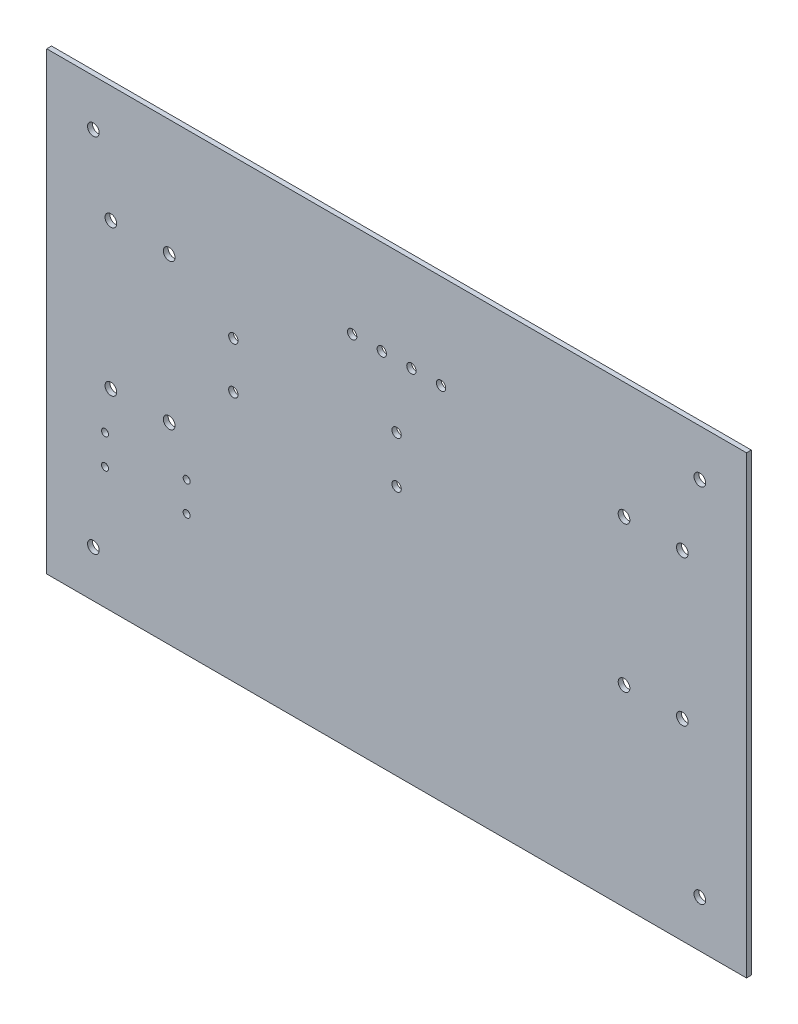
ISO-10303-21;
HEADER;
FILE_DESCRIPTION(('STEP AP214'),'2;1');
FILE_NAME('part.step','',(''),(''),'','','');
FILE_SCHEMA(('AUTOMOTIVE_DESIGN { 1 0 10303 214 1 1 1 1 }'));
ENDSEC;
DATA;
#1=APPLICATION_CONTEXT('core data for automotive mechanical design processes');
#2=APPLICATION_PROTOCOL_DEFINITION('international standard','automotive_design',2000,#1);
#3=PRODUCT_CONTEXT('',#1,'mechanical');
#4=PRODUCT('Part','Part','',(#3));
#5=PRODUCT_RELATED_PRODUCT_CATEGORY('part','',(#4));
#6=PRODUCT_DEFINITION_FORMATION('','',#4);
#7=PRODUCT_DEFINITION_CONTEXT('part definition',#1,'design');
#8=PRODUCT_DEFINITION('design','',#6,#7);
#9=PRODUCT_DEFINITION_SHAPE('','',#8);
#10=(LENGTH_UNIT() NAMED_UNIT(*) SI_UNIT(.MILLI.,.METRE.));
#11=(NAMED_UNIT(*) PLANE_ANGLE_UNIT() SI_UNIT($,.RADIAN.));
#12=(NAMED_UNIT(*) SI_UNIT($,.STERADIAN.) SOLID_ANGLE_UNIT());
#13=UNCERTAINTY_MEASURE_WITH_UNIT(LENGTH_MEASURE(1.E-05),#10,'distance_accuracy_value','');
#14=(GEOMETRIC_REPRESENTATION_CONTEXT(3) GLOBAL_UNCERTAINTY_ASSIGNED_CONTEXT((#13)) GLOBAL_UNIT_ASSIGNED_CONTEXT((#10,
#11,#12)) REPRESENTATION_CONTEXT('',''));
#15=CARTESIAN_POINT('',(0.,0.,0.));
#16=DIRECTION('',(0.,0.,1.));
#17=DIRECTION('',(1.,0.,0.));
#18=AXIS2_PLACEMENT_3D('',#15,#16,#17);
#19=CARTESIAN_POINT('',(-30.00000953674,-13.99999046325,0.));
#20=DIRECTION('',(0.,0.,-1.));
#21=DIRECTION('',(-1.,0.,0.));
#22=AXIS2_PLACEMENT_3D('',#19,#20,#21);
#23=PLANE('',#22);
#24=CARTESIAN_POINT('',(25.9999988,21.00000118,0.));
#25=DIRECTION('',(0.,0.,-1.));
#26=DIRECTION('',(-1.,0.,0.));
#27=AXIS2_PLACEMENT_3D('',#24,#25,#26);
#28=CIRCLE('',#27,0.499999);
#29=CARTESIAN_POINT('',(25.4999998,21.00000118,0.));
#30=VERTEX_POINT('',#29);
#31=EDGE_CURVE('E166',#30,#30,#28,.T.);
#32=ORIENTED_EDGE('',*,*,#31,.T.);
#33=EDGE_LOOP('',(#32));
#34=FACE_BOUND('',#33,.T.);
#35=CARTESIAN_POINT('',(3.81,16.90000176,0.));
#36=DIRECTION('',(0.,0.,-1.));
#37=DIRECTION('',(-1.,0.,0.));
#38=AXIS2_PLACEMENT_3D('',#35,#36,#37);
#39=CIRCLE('',#38,0.3999992);
#40=CARTESIAN_POINT('',(3.4100008,16.90000176,0.));
#41=VERTEX_POINT('',#40);
#42=EDGE_CURVE('E169',#41,#41,#39,.T.);
#43=ORIENTED_EDGE('',*,*,#42,.T.);
#44=EDGE_LOOP('',(#43));
#45=FACE_BOUND('',#44,.T.);
#46=CARTESIAN_POINT('',(19.4999991,15.00000048,0.));
#47=DIRECTION('',(0.,0.,-1.));
#48=DIRECTION('',(-1.,0.,0.));
#49=AXIS2_PLACEMENT_3D('',#46,#47,#48);
#50=CIRCLE('',#49,0.499999);
#51=CARTESIAN_POINT('',(19.0000001,15.00000048,0.));
#52=VERTEX_POINT('',#51);
#53=EDGE_CURVE('E172',#52,#52,#50,.T.);
#54=ORIENTED_EDGE('',*,*,#53,.T.);
#55=EDGE_LOOP('',(#54));
#56=FACE_BOUND('',#55,.T.);
#57=CARTESIAN_POINT('',(-1.27,16.90000176,0.));
#58=DIRECTION('',(0.,0.,-1.));
#59=DIRECTION('',(-1.,0.,0.));
#60=AXIS2_PLACEMENT_3D('',#57,#58,#59);
#61=CIRCLE('',#60,0.3999992);
#62=CARTESIAN_POINT('',(-1.6699992,16.90000176,0.));
#63=VERTEX_POINT('',#62);
#64=EDGE_CURVE('E175',#63,#63,#61,.T.);
#65=ORIENTED_EDGE('',*,*,#64,.T.);
#66=EDGE_LOOP('',(#65));
#67=FACE_BOUND('',#66,.T.);
#68=CARTESIAN_POINT('',(-3.81,16.90000176,0.));
#69=DIRECTION('',(0.,0.,-1.));
#70=DIRECTION('',(-1.,0.,0.));
#71=AXIS2_PLACEMENT_3D('',#68,#69,#70);
#72=CIRCLE('',#71,0.3999992);
#73=CARTESIAN_POINT('',(-4.2099992,16.90000176,0.));
#74=VERTEX_POINT('',#73);
#75=EDGE_CURVE('E178',#74,#74,#72,.T.);
#76=ORIENTED_EDGE('',*,*,#75,.T.);
#77=EDGE_LOOP('',(#76));
#78=FACE_BOUND('',#77,.T.);
#79=CARTESIAN_POINT('',(1.27,16.90000176,0.));
#80=DIRECTION('',(0.,0.,-1.));
#81=DIRECTION('',(-1.,0.,0.));
#82=AXIS2_PLACEMENT_3D('',#79,#80,#81);
#83=CIRCLE('',#82,0.3999992);
#84=CARTESIAN_POINT('',(0.8700008,16.90000176,0.));
#85=VERTEX_POINT('',#84);
#86=EDGE_CURVE('E181',#85,#85,#83,.T.);
#87=ORIENTED_EDGE('',*,*,#86,.T.);
#88=EDGE_LOOP('',(#87));
#89=FACE_BOUND('',#88,.T.);
#90=CARTESIAN_POINT('',(24.49999926,2.50000008,0.));
#91=DIRECTION('',(0.,0.,-1.));
#92=DIRECTION('',(-1.,0.,0.));
#93=AXIS2_PLACEMENT_3D('',#90,#91,#92);
#94=CIRCLE('',#93,0.499999);
#95=CARTESIAN_POINT('',(24.00000026,2.50000008,0.));
#96=VERTEX_POINT('',#95);
#97=EDGE_CURVE('E184',#96,#96,#94,.T.);
#98=ORIENTED_EDGE('',*,*,#97,.T.);
#99=EDGE_LOOP('',(#98));
#100=FACE_BOUND('',#99,.T.);
#101=CARTESIAN_POINT('',(24.49999926,15.00000048,0.));
#102=DIRECTION('',(0.,0.,-1.));
#103=DIRECTION('',(-1.,0.,0.));
#104=AXIS2_PLACEMENT_3D('',#101,#102,#103);
#105=CIRCLE('',#104,0.499999);
#106=CARTESIAN_POINT('',(24.00000026,15.00000048,0.));
#107=VERTEX_POINT('',#106);
#108=EDGE_CURVE('E187',#107,#107,#105,.T.);
#109=ORIENTED_EDGE('',*,*,#108,.T.);
#110=EDGE_LOOP('',(#109));
#111=FACE_BOUND('',#110,.T.);
#112=CARTESIAN_POINT('',(25.9999988,-10.00000032,0.));
#113=DIRECTION('',(0.,0.,-1.));
#114=DIRECTION('',(-1.,0.,0.));
#115=AXIS2_PLACEMENT_3D('',#112,#113,#114);
#116=CIRCLE('',#115,0.499999);
#117=CARTESIAN_POINT('',(25.4999998,-10.00000032,0.));
#118=VERTEX_POINT('',#117);
#119=EDGE_CURVE('E190',#118,#118,#116,.T.);
#120=ORIENTED_EDGE('',*,*,#119,.T.);
#121=EDGE_LOOP('',(#120));
#122=FACE_BOUND('',#121,.T.);
#123=CARTESIAN_POINT('',(0.,7.50000024,0.));
#124=DIRECTION('',(0.,0.,-1.));
#125=DIRECTION('',(-1.,0.,0.));
#126=AXIS2_PLACEMENT_3D('',#123,#124,#125);
#127=CIRCLE('',#126,0.3999992);
#128=CARTESIAN_POINT('',(-0.3999992,7.50000024,0.));
#129=VERTEX_POINT('',#128);
#130=EDGE_CURVE('E193',#129,#129,#127,.T.);
#131=ORIENTED_EDGE('',*,*,#130,.T.);
#132=EDGE_LOOP('',(#131));
#133=FACE_BOUND('',#132,.T.);
#134=CARTESIAN_POINT('',(0.,11.49999986,0.));
#135=DIRECTION('',(0.,0.,-1.));
#136=DIRECTION('',(-1.,0.,0.));
#137=AXIS2_PLACEMENT_3D('',#134,#135,#136);
#138=CIRCLE('',#137,0.3999992);
#139=CARTESIAN_POINT('',(-0.3999992,11.49999986,0.));
#140=VERTEX_POINT('',#139);
#141=EDGE_CURVE('E196',#140,#140,#138,.T.);
#142=ORIENTED_EDGE('',*,*,#141,.T.);
#143=EDGE_LOOP('',(#142));
#144=FACE_BOUND('',#143,.T.);
#145=CARTESIAN_POINT('',(19.4999991,2.50000008,0.));
#146=DIRECTION('',(0.,0.,-1.));
#147=DIRECTION('',(-1.,0.,0.));
#148=AXIS2_PLACEMENT_3D('',#145,#146,#147);
#149=CIRCLE('',#148,0.499999);
#150=CARTESIAN_POINT('',(19.0000001,2.50000008,0.));
#151=VERTEX_POINT('',#150);
#152=EDGE_CURVE('E199',#151,#151,#149,.T.);
#153=ORIENTED_EDGE('',*,*,#152,.T.);
#154=EDGE_LOOP('',(#153));
#155=FACE_BOUND('',#154,.T.);
#156=CARTESIAN_POINT('',(-14.00000248,11.49999986,0.));
#157=DIRECTION('',(0.,0.,-1.));
#158=DIRECTION('',(-1.,0.,0.));
#159=AXIS2_PLACEMENT_3D('',#156,#157,#158);
#160=CIRCLE('',#159,0.3999992);
#161=CARTESIAN_POINT('',(-14.40000168,11.49999986,0.));
#162=VERTEX_POINT('',#161);
#163=EDGE_CURVE('E202',#162,#162,#160,.T.);
#164=ORIENTED_EDGE('',*,*,#163,.T.);
#165=EDGE_LOOP('',(#164));
#166=FACE_BOUND('',#165,.T.);
#167=CARTESIAN_POINT('',(-19.50000164,15.00000048,0.));
#168=DIRECTION('',(0.,0.,-1.));
#169=DIRECTION('',(-1.,0.,0.));
#170=AXIS2_PLACEMENT_3D('',#167,#168,#169);
#171=CIRCLE('',#170,0.499999);
#172=CARTESIAN_POINT('',(-20.00000064,15.00000048,0.));
#173=VERTEX_POINT('',#172);
#174=EDGE_CURVE('E205',#173,#173,#171,.T.);
#175=ORIENTED_EDGE('',*,*,#174,.T.);
#176=EDGE_LOOP('',(#175));
#177=FACE_BOUND('',#176,.T.);
#178=CARTESIAN_POINT('',(-14.00000248,7.50000024,0.));
#179=DIRECTION('',(0.,0.,-1.));
#180=DIRECTION('',(-1.,0.,0.));
#181=AXIS2_PLACEMENT_3D('',#178,#179,#180);
#182=CIRCLE('',#181,0.3999992);
#183=CARTESIAN_POINT('',(-14.40000168,7.50000024,0.));
#184=VERTEX_POINT('',#183);
#185=EDGE_CURVE('E208',#184,#184,#182,.T.);
#186=ORIENTED_EDGE('',*,*,#185,.T.);
#187=EDGE_LOOP('',(#186));
#188=FACE_BOUND('',#187,.T.);
#189=CARTESIAN_POINT('',(-24.5000018,15.00000048,0.));
#190=DIRECTION('',(0.,0.,-1.));
#191=DIRECTION('',(-1.,0.,0.));
#192=AXIS2_PLACEMENT_3D('',#189,#190,#191);
#193=CIRCLE('',#192,0.499999);
#194=CARTESIAN_POINT('',(-25.0000008,15.00000048,0.));
#195=VERTEX_POINT('',#194);
#196=EDGE_CURVE('E211',#195,#195,#193,.T.);
#197=ORIENTED_EDGE('',*,*,#196,.T.);
#198=EDGE_LOOP('',(#197));
#199=FACE_BOUND('',#198,.T.);
#200=CARTESIAN_POINT('',(-26.00000134,21.00000118,0.));
#201=DIRECTION('',(0.,0.,-1.));
#202=DIRECTION('',(-1.,0.,0.));
#203=AXIS2_PLACEMENT_3D('',#200,#201,#202);
#204=CIRCLE('',#203,0.499999);
#205=CARTESIAN_POINT('',(-26.50000034,21.00000118,0.));
#206=VERTEX_POINT('',#205);
#207=EDGE_CURVE('E214',#206,#206,#204,.T.);
#208=ORIENTED_EDGE('',*,*,#207,.T.);
#209=EDGE_LOOP('',(#208));
#210=FACE_BOUND('',#209,.T.);
#211=CARTESIAN_POINT('',(-19.50000164,2.50000008,0.));
#212=DIRECTION('',(0.,0.,-1.));
#213=DIRECTION('',(-1.,0.,0.));
#214=AXIS2_PLACEMENT_3D('',#211,#212,#213);
#215=CIRCLE('',#214,0.499999);
#216=CARTESIAN_POINT('',(-20.00000064,2.50000008,0.));
#217=VERTEX_POINT('',#216);
#218=EDGE_CURVE('E217',#217,#217,#215,.T.);
#219=ORIENTED_EDGE('',*,*,#218,.T.);
#220=EDGE_LOOP('',(#219));
#221=FACE_BOUND('',#220,.T.);
#222=CARTESIAN_POINT('',(-17.99999956,-1.00000054,0.));
#223=DIRECTION('',(0.,0.,-1.));
#224=DIRECTION('',(-1.,0.,0.));
#225=AXIS2_PLACEMENT_3D('',#222,#223,#224);
#226=CIRCLE('',#225,0.2999994);
#227=CARTESIAN_POINT('',(-18.29999896,-1.00000054,0.));
#228=VERTEX_POINT('',#227);
#229=EDGE_CURVE('E220',#228,#228,#226,.T.);
#230=ORIENTED_EDGE('',*,*,#229,.T.);
#231=EDGE_LOOP('',(#230));
#232=FACE_BOUND('',#231,.T.);
#233=CARTESIAN_POINT('',(-24.5000018,2.50000008,0.));
#234=DIRECTION('',(0.,0.,-1.));
#235=DIRECTION('',(-1.,0.,0.));
#236=AXIS2_PLACEMENT_3D('',#233,#234,#235);
#237=CIRCLE('',#236,0.499999);
#238=CARTESIAN_POINT('',(-25.0000008,2.50000008,0.));
#239=VERTEX_POINT('',#238);
#240=EDGE_CURVE('E223',#239,#239,#237,.T.);
#241=ORIENTED_EDGE('',*,*,#240,.T.);
#242=EDGE_LOOP('',(#241));
#243=FACE_BOUND('',#242,.T.);
#244=CARTESIAN_POINT('',(-17.99999956,-3.54000054,0.));
#245=DIRECTION('',(0.,0.,-1.));
#246=DIRECTION('',(-1.,0.,0.));
#247=AXIS2_PLACEMENT_3D('',#244,#245,#246);
#248=CIRCLE('',#247,0.2999994);
#249=CARTESIAN_POINT('',(-18.29999896,-3.54000054,0.));
#250=VERTEX_POINT('',#249);
#251=EDGE_CURVE('E226',#250,#250,#248,.T.);
#252=ORIENTED_EDGE('',*,*,#251,.T.);
#253=EDGE_LOOP('',(#252));
#254=FACE_BOUND('',#253,.T.);
#255=CARTESIAN_POINT('',(-25.0000008,-3.54000054,0.));
#256=DIRECTION('',(0.,0.,-1.));
#257=DIRECTION('',(-1.,0.,0.));
#258=AXIS2_PLACEMENT_3D('',#255,#256,#257);
#259=CIRCLE('',#258,0.2999994);
#260=CARTESIAN_POINT('',(-25.3000002,-3.54000054,0.));
#261=VERTEX_POINT('',#260);
#262=EDGE_CURVE('E229',#261,#261,#259,.T.);
#263=ORIENTED_EDGE('',*,*,#262,.T.);
#264=EDGE_LOOP('',(#263));
#265=FACE_BOUND('',#264,.T.);
#266=CARTESIAN_POINT('',(-25.0000008,-1.00000054,0.));
#267=DIRECTION('',(0.,0.,-1.));
#268=DIRECTION('',(-1.,0.,0.));
#269=AXIS2_PLACEMENT_3D('',#266,#267,#268);
#270=CIRCLE('',#269,0.2999994);
#271=CARTESIAN_POINT('',(-25.3000002,-1.00000054,0.));
#272=VERTEX_POINT('',#271);
#273=EDGE_CURVE('E232',#272,#272,#270,.T.);
#274=ORIENTED_EDGE('',*,*,#273,.T.);
#275=EDGE_LOOP('',(#274));
#276=FACE_BOUND('',#275,.T.);
#277=CARTESIAN_POINT('',(-26.00000134,-10.00000032,0.));
#278=DIRECTION('',(0.,0.,-1.));
#279=DIRECTION('',(-1.,0.,0.));
#280=AXIS2_PLACEMENT_3D('',#277,#278,#279);
#281=CIRCLE('',#280,0.499999);
#282=CARTESIAN_POINT('',(-26.50000034,-10.00000032,0.));
#283=VERTEX_POINT('',#282);
#284=EDGE_CURVE('E235',#283,#283,#281,.T.);
#285=ORIENTED_EDGE('',*,*,#284,.T.);
#286=EDGE_LOOP('',(#285));
#287=FACE_BOUND('',#286,.T.);
#288=DIRECTION('',(2.44531876001593E-07,0.99999999999997,0.));
#289=VECTOR('',#288,1.);
#290=CARTESIAN_POINT('',(29.9999904632581,-14.0000051351626,0.));
#291=LINE('',#290,#289);
#292=CARTESIAN_POINT('',(29.999990463257,-14.0000095367363,0.));
#293=VERTEX_POINT('',#292);
#294=CARTESIAN_POINT('',(30.0000000000002,24.999990463257,0.));
#295=VERTEX_POINT('',#294);
#296=EDGE_CURVE('E20',#293,#295,#291,.T.);
#297=ORIENTED_EDGE('',*,*,#296,.T.);
#298=DIRECTION('',(0.999999999999949,-3.17891388274584E-07,0.));
#299=VECTOR('',#298,1.);
#300=CARTESIAN_POINT('',(30.,24.999990463257,0.));
#301=LINE('',#300,#299);
#302=CARTESIAN_POINT('',(-30.00000953674,25.0000095367432,0.));
#303=VERTEX_POINT('',#302);
#304=EDGE_CURVE('E63',#295,#303,#301,.F.);
#305=ORIENTED_EDGE('',*,*,#304,.T.);
#306=DIRECTION('',(0.,1.,0.));
#307=VECTOR('',#306,1.);
#308=CARTESIAN_POINT('',(-30.00000953674,25.000009536743,0.));
#309=LINE('',#308,#307);
#310=CARTESIAN_POINT('',(-30.00000953674,-13.99999046325,0.));
#311=VERTEX_POINT('',#310);
#312=EDGE_CURVE('E72',#303,#311,#309,.F.);
#313=ORIENTED_EDGE('',*,*,#312,.T.);
#314=DIRECTION('',(0.999999999999949,-3.17891438809022E-07,0.));
#315=VECTOR('',#314,1.);
#316=CARTESIAN_POINT('',(-30.00000953674,-13.99999046325,0.));
#317=LINE('',#316,#315);
#318=EDGE_CURVE('E50',#311,#293,#317,.T.);
#319=ORIENTED_EDGE('',*,*,#318,.T.);
#320=EDGE_LOOP('',(#297,#305,#313,#319));
#321=FACE_BOUND('',#320,.T.);
#322=ADVANCED_FACE('F17',(#34,#45,#56,#67,#78,#89,#100,#111,#122,#133,#144,#155,#166,#177,#188,
#199,#210,#221,#232,#243,#254,#265,#276,#287,#321),#23,.F.);
#323=CARTESIAN_POINT('',(-30.00000953674,25.000009536743,-0.41148));
#324=DIRECTION('',(1.,0.,0.));
#325=DIRECTION('',(0.,0.,-1.));
#326=AXIS2_PLACEMENT_3D('',#323,#324,#325);
#327=PLANE('',#326);
#328=DIRECTION('',(0.,0.,1.));
#329=VECTOR('',#328,1.);
#330=CARTESIAN_POINT('',(-30.00000953674,-13.99999046325,-0.41148));
#331=LINE('',#330,#329);
#332=CARTESIAN_POINT('',(-30.00000953674,-13.99999046325,-0.41148));
#333=VERTEX_POINT('',#332);
#334=EDGE_CURVE('E78',#333,#311,#331,.T.);
#335=ORIENTED_EDGE('',*,*,#334,.T.);
#336=ORIENTED_EDGE('',*,*,#312,.F.);
#337=DIRECTION('',(0.,0.,1.));
#338=VECTOR('',#337,1.);
#339=CARTESIAN_POINT('',(-30.00000953674,25.0000095367433,-0.41148));
#340=LINE('',#339,#338);
#341=CARTESIAN_POINT('',(-30.00000953674,25.0000095367431,-0.41148));
#342=VERTEX_POINT('',#341);
#343=EDGE_CURVE('E67',#303,#342,#340,.F.);
#344=ORIENTED_EDGE('',*,*,#343,.T.);
#345=DIRECTION('',(0.,1.,0.));
#346=VECTOR('',#345,1.);
#347=CARTESIAN_POINT('',(-30.00000953674,-13.99999046325,-0.41148));
#348=LINE('',#347,#346);
#349=EDGE_CURVE('E56',#333,#342,#348,.T.);
#350=ORIENTED_EDGE('',*,*,#349,.F.);
#351=EDGE_LOOP('',(#335,#336,#344,#350));
#352=FACE_BOUND('',#351,.T.);
#353=ADVANCED_FACE('F245',(#352),#327,.F.);
#354=CARTESIAN_POINT('',(30.,24.999990463257,-0.41148));
#355=DIRECTION('',(-3.17891388274584E-07,-0.999999999999949,0.));
#356=DIRECTION('',(0.999999999999949,-3.17891388274584E-07,0.));
#357=AXIS2_PLACEMENT_3D('',#354,#355,#356);
#358=PLANE('',#357);
#359=ORIENTED_EDGE('',*,*,#343,.F.);
#360=ORIENTED_EDGE('',*,*,#304,.F.);
#361=DIRECTION('',(0.,0.,1.));
#362=VECTOR('',#361,1.);
#363=CARTESIAN_POINT('',(30.0000000000002,24.999990463257,-0.41148));
#364=LINE('',#363,#362);
#365=CARTESIAN_POINT('',(30.0000000000002,24.999990463257,-0.41148));
#366=VERTEX_POINT('',#365);
#367=EDGE_CURVE('E66',#295,#366,#364,.F.);
#368=ORIENTED_EDGE('',*,*,#367,.T.);
#369=DIRECTION('',(0.999999999999949,-3.17891382788257E-07,0.));
#370=VECTOR('',#369,1.);
#371=CARTESIAN_POINT('',(-30.00000953674,25.000009536743,-0.41148));
#372=LINE('',#371,#370);
#373=EDGE_CURVE('E165',#342,#366,#372,.T.);
#374=ORIENTED_EDGE('',*,*,#373,.F.);
#375=EDGE_LOOP('',(#359,#360,#368,#374));
#376=FACE_BOUND('',#375,.T.);
#377=ADVANCED_FACE('F70',(#376),#358,.F.);
#378=CARTESIAN_POINT('',(29.999990463257,-14.00000953674,-0.41148));
#379=DIRECTION('',(-0.99999999999997,2.44531876001593E-07,0.));
#380=DIRECTION('',(-2.44531876001593E-07,-0.99999999999997,0.));
#381=AXIS2_PLACEMENT_3D('',#378,#379,#380);
#382=PLANE('',#381);
#383=ORIENTED_EDGE('',*,*,#367,.F.);
#384=ORIENTED_EDGE('',*,*,#296,.F.);
#385=DIRECTION('',(0.,0.,1.));
#386=VECTOR('',#385,1.);
#387=CARTESIAN_POINT('',(29.999990463257,-14.0000095367363,-0.41148));
#388=LINE('',#387,#386);
#389=CARTESIAN_POINT('',(29.999990463257,-14.0000095367382,-0.41148));
#390=VERTEX_POINT('',#389);
#391=EDGE_CURVE('E35',#293,#390,#388,.F.);
#392=ORIENTED_EDGE('',*,*,#391,.T.);
#393=DIRECTION('',(-2.44531876001593E-07,-0.99999999999997,0.));
#394=VECTOR('',#393,1.);
#395=CARTESIAN_POINT('',(29.999990463257,-14.00000953674,-0.41148));
#396=LINE('',#395,#394);
#397=EDGE_CURVE('E76',#366,#390,#396,.T.);
#398=ORIENTED_EDGE('',*,*,#397,.F.);
#399=EDGE_LOOP('',(#383,#384,#392,#398));
#400=FACE_BOUND('',#399,.T.);
#401=ADVANCED_FACE('F74',(#400),#382,.F.);
#402=CARTESIAN_POINT('',(-30.00000953674,-13.99999046325,-0.41148));
#403=DIRECTION('',(3.17891438802084E-07,0.999999999999949,0.));
#404=DIRECTION('',(-0.999999999999949,3.17891438802084E-07,0.));
#405=AXIS2_PLACEMENT_3D('',#402,#403,#404);
#406=PLANE('',#405);
#407=ORIENTED_EDGE('',*,*,#391,.F.);
#408=ORIENTED_EDGE('',*,*,#318,.F.);
#409=ORIENTED_EDGE('',*,*,#334,.F.);
#410=DIRECTION('',(-0.999999999999949,3.17891499997722E-07,0.));
#411=VECTOR('',#410,1.);
#412=CARTESIAN_POINT('',(30.,-14.000009536743,-0.41148));
#413=LINE('',#412,#411);
#414=EDGE_CURVE('E161',#390,#333,#413,.T.);
#415=ORIENTED_EDGE('',*,*,#414,.F.);
#416=EDGE_LOOP('',(#407,#408,#409,#415));
#417=FACE_BOUND('',#416,.T.);
#418=ADVANCED_FACE('F244',(#417),#406,.F.);
#419=CARTESIAN_POINT('',(-26.00000134,-10.00000032,-0.41148));
#420=DIRECTION('',(0.,0.,-1.));
#421=DIRECTION('',(-1.,0.,0.));
#422=AXIS2_PLACEMENT_3D('',#419,#420,#421);
#423=CYLINDRICAL_SURFACE('',#422,0.499999);
#424=ORIENTED_EDGE('',*,*,#284,.F.);
#425=EDGE_LOOP('',(#424));
#426=FACE_BOUND('',#425,.T.);
#427=CARTESIAN_POINT('',(-26.00000134,-10.00000032,-0.41148));
#428=DIRECTION('',(0.,0.,-1.));
#429=DIRECTION('',(-1.,0.,0.));
#430=AXIS2_PLACEMENT_3D('',#427,#428,#429);
#431=CIRCLE('',#430,0.499999);
#432=CARTESIAN_POINT('',(-26.50000034,-10.00000032,-0.41148));
#433=VERTEX_POINT('',#432);
#434=EDGE_CURVE('E158',#433,#433,#431,.F.);
#435=ORIENTED_EDGE('',*,*,#434,.F.);
#436=EDGE_LOOP('',(#435));
#437=FACE_BOUND('',#436,.T.);
#438=ADVANCED_FACE('F352',(#426,#437),#423,.F.);
#439=CARTESIAN_POINT('',(-25.0000008,-1.00000054,-0.41148));
#440=DIRECTION('',(0.,0.,-1.));
#441=DIRECTION('',(-1.,0.,0.));
#442=AXIS2_PLACEMENT_3D('',#439,#440,#441);
#443=CYLINDRICAL_SURFACE('',#442,0.2999994);
#444=ORIENTED_EDGE('',*,*,#273,.F.);
#445=EDGE_LOOP('',(#444));
#446=FACE_BOUND('',#445,.T.);
#447=CARTESIAN_POINT('',(-25.0000008,-1.00000054,-0.41148));
#448=DIRECTION('',(0.,0.,-1.));
#449=DIRECTION('',(-1.,0.,0.));
#450=AXIS2_PLACEMENT_3D('',#447,#448,#449);
#451=CIRCLE('',#450,0.2999994);
#452=CARTESIAN_POINT('',(-25.3000002,-1.00000054,-0.41148));
#453=VERTEX_POINT('',#452);
#454=EDGE_CURVE('E155',#453,#453,#451,.F.);
#455=ORIENTED_EDGE('',*,*,#454,.F.);
#456=EDGE_LOOP('',(#455));
#457=FACE_BOUND('',#456,.T.);
#458=ADVANCED_FACE('F348',(#446,#457),#443,.F.);
#459=CARTESIAN_POINT('',(-25.0000008,-3.54000054,-0.41148));
#460=DIRECTION('',(0.,0.,-1.));
#461=DIRECTION('',(-1.,0.,0.));
#462=AXIS2_PLACEMENT_3D('',#459,#460,#461);
#463=CYLINDRICAL_SURFACE('',#462,0.2999994);
#464=ORIENTED_EDGE('',*,*,#262,.F.);
#465=EDGE_LOOP('',(#464));
#466=FACE_BOUND('',#465,.T.);
#467=CARTESIAN_POINT('',(-25.0000008,-3.54000054,-0.41148));
#468=DIRECTION('',(0.,0.,-1.));
#469=DIRECTION('',(-1.,0.,0.));
#470=AXIS2_PLACEMENT_3D('',#467,#468,#469);
#471=CIRCLE('',#470,0.2999994);
#472=CARTESIAN_POINT('',(-25.3000002,-3.54000054,-0.41148));
#473=VERTEX_POINT('',#472);
#474=EDGE_CURVE('E152',#473,#473,#471,.F.);
#475=ORIENTED_EDGE('',*,*,#474,.F.);
#476=EDGE_LOOP('',(#475));
#477=FACE_BOUND('',#476,.T.);
#478=ADVANCED_FACE('F344',(#466,#477),#463,.F.);
#479=CARTESIAN_POINT('',(-17.99999956,-3.54000054,-0.41148));
#480=DIRECTION('',(0.,0.,-1.));
#481=DIRECTION('',(-1.,0.,0.));
#482=AXIS2_PLACEMENT_3D('',#479,#480,#481);
#483=CYLINDRICAL_SURFACE('',#482,0.2999994);
#484=ORIENTED_EDGE('',*,*,#251,.F.);
#485=EDGE_LOOP('',(#484));
#486=FACE_BOUND('',#485,.T.);
#487=CARTESIAN_POINT('',(-17.99999956,-3.54000054,-0.41148));
#488=DIRECTION('',(0.,0.,-1.));
#489=DIRECTION('',(-1.,0.,0.));
#490=AXIS2_PLACEMENT_3D('',#487,#488,#489);
#491=CIRCLE('',#490,0.2999994);
#492=CARTESIAN_POINT('',(-18.29999896,-3.54000054,-0.41148));
#493=VERTEX_POINT('',#492);
#494=EDGE_CURVE('E149',#493,#493,#491,.F.);
#495=ORIENTED_EDGE('',*,*,#494,.F.);
#496=EDGE_LOOP('',(#495));
#497=FACE_BOUND('',#496,.T.);
#498=ADVANCED_FACE('F340',(#486,#497),#483,.F.);
#499=CARTESIAN_POINT('',(-24.5000018,2.50000008,-0.41148));
#500=DIRECTION('',(0.,0.,-1.));
#501=DIRECTION('',(-1.,0.,0.));
#502=AXIS2_PLACEMENT_3D('',#499,#500,#501);
#503=CYLINDRICAL_SURFACE('',#502,0.499999);
#504=ORIENTED_EDGE('',*,*,#240,.F.);
#505=EDGE_LOOP('',(#504));
#506=FACE_BOUND('',#505,.T.);
#507=CARTESIAN_POINT('',(-24.5000018,2.50000008,-0.41148));
#508=DIRECTION('',(0.,0.,-1.));
#509=DIRECTION('',(-1.,0.,0.));
#510=AXIS2_PLACEMENT_3D('',#507,#508,#509);
#511=CIRCLE('',#510,0.499999);
#512=CARTESIAN_POINT('',(-25.0000008,2.50000008,-0.41148));
#513=VERTEX_POINT('',#512);
#514=EDGE_CURVE('E146',#513,#513,#511,.F.);
#515=ORIENTED_EDGE('',*,*,#514,.F.);
#516=EDGE_LOOP('',(#515));
#517=FACE_BOUND('',#516,.T.);
#518=ADVANCED_FACE('F336',(#506,#517),#503,.F.);
#519=CARTESIAN_POINT('',(-17.99999956,-1.00000054,-0.41148));
#520=DIRECTION('',(0.,0.,-1.));
#521=DIRECTION('',(-1.,0.,0.));
#522=AXIS2_PLACEMENT_3D('',#519,#520,#521);
#523=CYLINDRICAL_SURFACE('',#522,0.2999994);
#524=ORIENTED_EDGE('',*,*,#229,.F.);
#525=EDGE_LOOP('',(#524));
#526=FACE_BOUND('',#525,.T.);
#527=CARTESIAN_POINT('',(-17.99999956,-1.00000054,-0.41148));
#528=DIRECTION('',(0.,0.,-1.));
#529=DIRECTION('',(-1.,0.,0.));
#530=AXIS2_PLACEMENT_3D('',#527,#528,#529);
#531=CIRCLE('',#530,0.2999994);
#532=CARTESIAN_POINT('',(-18.29999896,-1.00000054,-0.41148));
#533=VERTEX_POINT('',#532);
#534=EDGE_CURVE('E143',#533,#533,#531,.F.);
#535=ORIENTED_EDGE('',*,*,#534,.F.);
#536=EDGE_LOOP('',(#535));
#537=FACE_BOUND('',#536,.T.);
#538=ADVANCED_FACE('F332',(#526,#537),#523,.F.);
#539=CARTESIAN_POINT('',(-19.50000164,2.50000008,-0.41148));
#540=DIRECTION('',(0.,0.,-1.));
#541=DIRECTION('',(-1.,0.,0.));
#542=AXIS2_PLACEMENT_3D('',#539,#540,#541);
#543=CYLINDRICAL_SURFACE('',#542,0.499999);
#544=ORIENTED_EDGE('',*,*,#218,.F.);
#545=EDGE_LOOP('',(#544));
#546=FACE_BOUND('',#545,.T.);
#547=CARTESIAN_POINT('',(-19.50000164,2.50000008,-0.41148));
#548=DIRECTION('',(0.,0.,-1.));
#549=DIRECTION('',(-1.,0.,0.));
#550=AXIS2_PLACEMENT_3D('',#547,#548,#549);
#551=CIRCLE('',#550,0.499999);
#552=CARTESIAN_POINT('',(-20.00000064,2.50000008,-0.41148));
#553=VERTEX_POINT('',#552);
#554=EDGE_CURVE('E140',#553,#553,#551,.F.);
#555=ORIENTED_EDGE('',*,*,#554,.F.);
#556=EDGE_LOOP('',(#555));
#557=FACE_BOUND('',#556,.T.);
#558=ADVANCED_FACE('F328',(#546,#557),#543,.F.);
#559=CARTESIAN_POINT('',(-26.00000134,21.00000118,-0.41148));
#560=DIRECTION('',(0.,0.,-1.));
#561=DIRECTION('',(-1.,0.,0.));
#562=AXIS2_PLACEMENT_3D('',#559,#560,#561);
#563=CYLINDRICAL_SURFACE('',#562,0.499999);
#564=ORIENTED_EDGE('',*,*,#207,.F.);
#565=EDGE_LOOP('',(#564));
#566=FACE_BOUND('',#565,.T.);
#567=CARTESIAN_POINT('',(-26.00000134,21.00000118,-0.41148));
#568=DIRECTION('',(0.,0.,-1.));
#569=DIRECTION('',(-1.,0.,0.));
#570=AXIS2_PLACEMENT_3D('',#567,#568,#569);
#571=CIRCLE('',#570,0.499999);
#572=CARTESIAN_POINT('',(-26.50000034,21.00000118,-0.41148));
#573=VERTEX_POINT('',#572);
#574=EDGE_CURVE('E137',#573,#573,#571,.F.);
#575=ORIENTED_EDGE('',*,*,#574,.F.);
#576=EDGE_LOOP('',(#575));
#577=FACE_BOUND('',#576,.T.);
#578=ADVANCED_FACE('F324',(#566,#577),#563,.F.);
#579=CARTESIAN_POINT('',(-24.5000018,15.00000048,-0.41148));
#580=DIRECTION('',(0.,0.,-1.));
#581=DIRECTION('',(-1.,0.,0.));
#582=AXIS2_PLACEMENT_3D('',#579,#580,#581);
#583=CYLINDRICAL_SURFACE('',#582,0.499999);
#584=ORIENTED_EDGE('',*,*,#196,.F.);
#585=EDGE_LOOP('',(#584));
#586=FACE_BOUND('',#585,.T.);
#587=CARTESIAN_POINT('',(-24.5000018,15.00000048,-0.41148));
#588=DIRECTION('',(0.,0.,-1.));
#589=DIRECTION('',(-1.,0.,0.));
#590=AXIS2_PLACEMENT_3D('',#587,#588,#589);
#591=CIRCLE('',#590,0.499999);
#592=CARTESIAN_POINT('',(-25.0000008,15.00000048,-0.41148));
#593=VERTEX_POINT('',#592);
#594=EDGE_CURVE('E134',#593,#593,#591,.F.);
#595=ORIENTED_EDGE('',*,*,#594,.F.);
#596=EDGE_LOOP('',(#595));
#597=FACE_BOUND('',#596,.T.);
#598=ADVANCED_FACE('F320',(#586,#597),#583,.F.);
#599=CARTESIAN_POINT('',(-14.00000248,7.50000024,-0.41148));
#600=DIRECTION('',(0.,0.,-1.));
#601=DIRECTION('',(-1.,0.,0.));
#602=AXIS2_PLACEMENT_3D('',#599,#600,#601);
#603=CYLINDRICAL_SURFACE('',#602,0.3999992);
#604=ORIENTED_EDGE('',*,*,#185,.F.);
#605=EDGE_LOOP('',(#604));
#606=FACE_BOUND('',#605,.T.);
#607=CARTESIAN_POINT('',(-14.00000248,7.50000024,-0.41148));
#608=DIRECTION('',(0.,0.,-1.));
#609=DIRECTION('',(-1.,0.,0.));
#610=AXIS2_PLACEMENT_3D('',#607,#608,#609);
#611=CIRCLE('',#610,0.3999992);
#612=CARTESIAN_POINT('',(-14.40000168,7.50000024,-0.41148));
#613=VERTEX_POINT('',#612);
#614=EDGE_CURVE('E131',#613,#613,#611,.F.);
#615=ORIENTED_EDGE('',*,*,#614,.F.);
#616=EDGE_LOOP('',(#615));
#617=FACE_BOUND('',#616,.T.);
#618=ADVANCED_FACE('F316',(#606,#617),#603,.F.);
#619=CARTESIAN_POINT('',(-19.50000164,15.00000048,-0.41148));
#620=DIRECTION('',(0.,0.,-1.));
#621=DIRECTION('',(-1.,0.,0.));
#622=AXIS2_PLACEMENT_3D('',#619,#620,#621);
#623=CYLINDRICAL_SURFACE('',#622,0.499999);
#624=ORIENTED_EDGE('',*,*,#174,.F.);
#625=EDGE_LOOP('',(#624));
#626=FACE_BOUND('',#625,.T.);
#627=CARTESIAN_POINT('',(-19.50000164,15.00000048,-0.41148));
#628=DIRECTION('',(0.,0.,-1.));
#629=DIRECTION('',(-1.,0.,0.));
#630=AXIS2_PLACEMENT_3D('',#627,#628,#629);
#631=CIRCLE('',#630,0.499999);
#632=CARTESIAN_POINT('',(-20.00000064,15.00000048,-0.41148));
#633=VERTEX_POINT('',#632);
#634=EDGE_CURVE('E128',#633,#633,#631,.F.);
#635=ORIENTED_EDGE('',*,*,#634,.F.);
#636=EDGE_LOOP('',(#635));
#637=FACE_BOUND('',#636,.T.);
#638=ADVANCED_FACE('F312',(#626,#637),#623,.F.);
#639=CARTESIAN_POINT('',(-14.00000248,11.49999986,-0.41148));
#640=DIRECTION('',(0.,0.,-1.));
#641=DIRECTION('',(-1.,0.,0.));
#642=AXIS2_PLACEMENT_3D('',#639,#640,#641);
#643=CYLINDRICAL_SURFACE('',#642,0.3999992);
#644=ORIENTED_EDGE('',*,*,#163,.F.);
#645=EDGE_LOOP('',(#644));
#646=FACE_BOUND('',#645,.T.);
#647=CARTESIAN_POINT('',(-14.00000248,11.49999986,-0.41148));
#648=DIRECTION('',(0.,0.,-1.));
#649=DIRECTION('',(-1.,0.,0.));
#650=AXIS2_PLACEMENT_3D('',#647,#648,#649);
#651=CIRCLE('',#650,0.3999992);
#652=CARTESIAN_POINT('',(-14.40000168,11.49999986,-0.41148));
#653=VERTEX_POINT('',#652);
#654=EDGE_CURVE('E125',#653,#653,#651,.F.);
#655=ORIENTED_EDGE('',*,*,#654,.F.);
#656=EDGE_LOOP('',(#655));
#657=FACE_BOUND('',#656,.T.);
#658=ADVANCED_FACE('F308',(#646,#657),#643,.F.);
#659=CARTESIAN_POINT('',(19.4999991,2.50000008,-0.41148));
#660=DIRECTION('',(0.,0.,-1.));
#661=DIRECTION('',(-1.,0.,0.));
#662=AXIS2_PLACEMENT_3D('',#659,#660,#661);
#663=CYLINDRICAL_SURFACE('',#662,0.499999);
#664=ORIENTED_EDGE('',*,*,#152,.F.);
#665=EDGE_LOOP('',(#664));
#666=FACE_BOUND('',#665,.T.);
#667=CARTESIAN_POINT('',(19.4999991,2.50000008,-0.41148));
#668=DIRECTION('',(0.,0.,-1.));
#669=DIRECTION('',(-1.,0.,0.));
#670=AXIS2_PLACEMENT_3D('',#667,#668,#669);
#671=CIRCLE('',#670,0.499999);
#672=CARTESIAN_POINT('',(19.0000001,2.50000008,-0.41148));
#673=VERTEX_POINT('',#672);
#674=EDGE_CURVE('E122',#673,#673,#671,.F.);
#675=ORIENTED_EDGE('',*,*,#674,.F.);
#676=EDGE_LOOP('',(#675));
#677=FACE_BOUND('',#676,.T.);
#678=ADVANCED_FACE('F304',(#666,#677),#663,.F.);
#679=CARTESIAN_POINT('',(0.,11.49999986,-0.41148));
#680=DIRECTION('',(0.,0.,-1.));
#681=DIRECTION('',(-1.,0.,0.));
#682=AXIS2_PLACEMENT_3D('',#679,#680,#681);
#683=CYLINDRICAL_SURFACE('',#682,0.3999992);
#684=ORIENTED_EDGE('',*,*,#141,.F.);
#685=EDGE_LOOP('',(#684));
#686=FACE_BOUND('',#685,.T.);
#687=CARTESIAN_POINT('',(0.,11.49999986,-0.41148));
#688=DIRECTION('',(0.,0.,-1.));
#689=DIRECTION('',(-1.,0.,0.));
#690=AXIS2_PLACEMENT_3D('',#687,#688,#689);
#691=CIRCLE('',#690,0.3999992);
#692=CARTESIAN_POINT('',(-0.3999992,11.49999986,-0.41148));
#693=VERTEX_POINT('',#692);
#694=EDGE_CURVE('E119',#693,#693,#691,.F.);
#695=ORIENTED_EDGE('',*,*,#694,.F.);
#696=EDGE_LOOP('',(#695));
#697=FACE_BOUND('',#696,.T.);
#698=ADVANCED_FACE('F300',(#686,#697),#683,.F.);
#699=CARTESIAN_POINT('',(0.,7.50000024,-0.41148));
#700=DIRECTION('',(0.,0.,-1.));
#701=DIRECTION('',(-1.,0.,0.));
#702=AXIS2_PLACEMENT_3D('',#699,#700,#701);
#703=CYLINDRICAL_SURFACE('',#702,0.3999992);
#704=ORIENTED_EDGE('',*,*,#130,.F.);
#705=EDGE_LOOP('',(#704));
#706=FACE_BOUND('',#705,.T.);
#707=CARTESIAN_POINT('',(0.,7.50000024,-0.41148));
#708=DIRECTION('',(0.,0.,-1.));
#709=DIRECTION('',(-1.,0.,0.));
#710=AXIS2_PLACEMENT_3D('',#707,#708,#709);
#711=CIRCLE('',#710,0.3999992);
#712=CARTESIAN_POINT('',(-0.3999992,7.50000024,-0.41148));
#713=VERTEX_POINT('',#712);
#714=EDGE_CURVE('E116',#713,#713,#711,.F.);
#715=ORIENTED_EDGE('',*,*,#714,.F.);
#716=EDGE_LOOP('',(#715));
#717=FACE_BOUND('',#716,.T.);
#718=ADVANCED_FACE('F296',(#706,#717),#703,.F.);
#719=CARTESIAN_POINT('',(25.9999988,-10.00000032,-0.41148));
#720=DIRECTION('',(0.,0.,-1.));
#721=DIRECTION('',(-1.,0.,0.));
#722=AXIS2_PLACEMENT_3D('',#719,#720,#721);
#723=CYLINDRICAL_SURFACE('',#722,0.499999);
#724=ORIENTED_EDGE('',*,*,#119,.F.);
#725=EDGE_LOOP('',(#724));
#726=FACE_BOUND('',#725,.T.);
#727=CARTESIAN_POINT('',(25.9999988,-10.00000032,-0.41148));
#728=DIRECTION('',(0.,0.,-1.));
#729=DIRECTION('',(-1.,0.,0.));
#730=AXIS2_PLACEMENT_3D('',#727,#728,#729);
#731=CIRCLE('',#730,0.499999);
#732=CARTESIAN_POINT('',(25.4999998,-10.00000032,-0.41148));
#733=VERTEX_POINT('',#732);
#734=EDGE_CURVE('E113',#733,#733,#731,.F.);
#735=ORIENTED_EDGE('',*,*,#734,.F.);
#736=EDGE_LOOP('',(#735));
#737=FACE_BOUND('',#736,.T.);
#738=ADVANCED_FACE('F292',(#726,#737),#723,.F.);
#739=CARTESIAN_POINT('',(24.49999926,15.00000048,-0.41148));
#740=DIRECTION('',(0.,0.,-1.));
#741=DIRECTION('',(-1.,0.,0.));
#742=AXIS2_PLACEMENT_3D('',#739,#740,#741);
#743=CYLINDRICAL_SURFACE('',#742,0.499999);
#744=ORIENTED_EDGE('',*,*,#108,.F.);
#745=EDGE_LOOP('',(#744));
#746=FACE_BOUND('',#745,.T.);
#747=CARTESIAN_POINT('',(24.49999926,15.00000048,-0.41148));
#748=DIRECTION('',(0.,0.,-1.));
#749=DIRECTION('',(-1.,0.,0.));
#750=AXIS2_PLACEMENT_3D('',#747,#748,#749);
#751=CIRCLE('',#750,0.499999);
#752=CARTESIAN_POINT('',(24.00000026,15.00000048,-0.41148));
#753=VERTEX_POINT('',#752);
#754=EDGE_CURVE('E110',#753,#753,#751,.F.);
#755=ORIENTED_EDGE('',*,*,#754,.F.);
#756=EDGE_LOOP('',(#755));
#757=FACE_BOUND('',#756,.T.);
#758=ADVANCED_FACE('F288',(#746,#757),#743,.F.);
#759=CARTESIAN_POINT('',(24.49999926,2.50000008,-0.41148));
#760=DIRECTION('',(0.,0.,-1.));
#761=DIRECTION('',(-1.,0.,0.));
#762=AXIS2_PLACEMENT_3D('',#759,#760,#761);
#763=CYLINDRICAL_SURFACE('',#762,0.499999);
#764=ORIENTED_EDGE('',*,*,#97,.F.);
#765=EDGE_LOOP('',(#764));
#766=FACE_BOUND('',#765,.T.);
#767=CARTESIAN_POINT('',(24.49999926,2.50000008,-0.41148));
#768=DIRECTION('',(0.,0.,-1.));
#769=DIRECTION('',(-1.,0.,0.));
#770=AXIS2_PLACEMENT_3D('',#767,#768,#769);
#771=CIRCLE('',#770,0.499999);
#772=CARTESIAN_POINT('',(24.00000026,2.50000008,-0.41148));
#773=VERTEX_POINT('',#772);
#774=EDGE_CURVE('E107',#773,#773,#771,.F.);
#775=ORIENTED_EDGE('',*,*,#774,.F.);
#776=EDGE_LOOP('',(#775));
#777=FACE_BOUND('',#776,.T.);
#778=ADVANCED_FACE('F284',(#766,#777),#763,.F.);
#779=CARTESIAN_POINT('',(1.27,16.90000176,-0.41148));
#780=DIRECTION('',(0.,0.,-1.));
#781=DIRECTION('',(-1.,0.,0.));
#782=AXIS2_PLACEMENT_3D('',#779,#780,#781);
#783=CYLINDRICAL_SURFACE('',#782,0.3999992);
#784=ORIENTED_EDGE('',*,*,#86,.F.);
#785=EDGE_LOOP('',(#784));
#786=FACE_BOUND('',#785,.T.);
#787=CARTESIAN_POINT('',(1.27,16.90000176,-0.41148));
#788=DIRECTION('',(0.,0.,-1.));
#789=DIRECTION('',(-1.,0.,0.));
#790=AXIS2_PLACEMENT_3D('',#787,#788,#789);
#791=CIRCLE('',#790,0.3999992);
#792=CARTESIAN_POINT('',(0.8700008,16.90000176,-0.41148));
#793=VERTEX_POINT('',#792);
#794=EDGE_CURVE('E104',#793,#793,#791,.F.);
#795=ORIENTED_EDGE('',*,*,#794,.F.);
#796=EDGE_LOOP('',(#795));
#797=FACE_BOUND('',#796,.T.);
#798=ADVANCED_FACE('F280',(#786,#797),#783,.F.);
#799=CARTESIAN_POINT('',(-3.81,16.90000176,-0.41148));
#800=DIRECTION('',(0.,0.,-1.));
#801=DIRECTION('',(-1.,0.,0.));
#802=AXIS2_PLACEMENT_3D('',#799,#800,#801);
#803=CYLINDRICAL_SURFACE('',#802,0.3999992);
#804=ORIENTED_EDGE('',*,*,#75,.F.);
#805=EDGE_LOOP('',(#804));
#806=FACE_BOUND('',#805,.T.);
#807=CARTESIAN_POINT('',(-3.81,16.90000176,-0.41148));
#808=DIRECTION('',(0.,0.,-1.));
#809=DIRECTION('',(-1.,0.,0.));
#810=AXIS2_PLACEMENT_3D('',#807,#808,#809);
#811=CIRCLE('',#810,0.3999992);
#812=CARTESIAN_POINT('',(-4.2099992,16.90000176,-0.41148));
#813=VERTEX_POINT('',#812);
#814=EDGE_CURVE('E101',#813,#813,#811,.F.);
#815=ORIENTED_EDGE('',*,*,#814,.F.);
#816=EDGE_LOOP('',(#815));
#817=FACE_BOUND('',#816,.T.);
#818=ADVANCED_FACE('F276',(#806,#817),#803,.F.);
#819=CARTESIAN_POINT('',(-1.27,16.90000176,-0.41148));
#820=DIRECTION('',(0.,0.,-1.));
#821=DIRECTION('',(-1.,0.,0.));
#822=AXIS2_PLACEMENT_3D('',#819,#820,#821);
#823=CYLINDRICAL_SURFACE('',#822,0.3999992);
#824=ORIENTED_EDGE('',*,*,#64,.F.);
#825=EDGE_LOOP('',(#824));
#826=FACE_BOUND('',#825,.T.);
#827=CARTESIAN_POINT('',(-1.27,16.90000176,-0.41148));
#828=DIRECTION('',(0.,0.,-1.));
#829=DIRECTION('',(-1.,0.,0.));
#830=AXIS2_PLACEMENT_3D('',#827,#828,#829);
#831=CIRCLE('',#830,0.3999992);
#832=CARTESIAN_POINT('',(-1.6699992,16.90000176,-0.41148));
#833=VERTEX_POINT('',#832);
#834=EDGE_CURVE('E98',#833,#833,#831,.F.);
#835=ORIENTED_EDGE('',*,*,#834,.F.);
#836=EDGE_LOOP('',(#835));
#837=FACE_BOUND('',#836,.T.);
#838=ADVANCED_FACE('F272',(#826,#837),#823,.F.);
#839=CARTESIAN_POINT('',(19.4999991,15.00000048,-0.41148));
#840=DIRECTION('',(0.,0.,-1.));
#841=DIRECTION('',(-1.,0.,0.));
#842=AXIS2_PLACEMENT_3D('',#839,#840,#841);
#843=CYLINDRICAL_SURFACE('',#842,0.499999);
#844=ORIENTED_EDGE('',*,*,#53,.F.);
#845=EDGE_LOOP('',(#844));
#846=FACE_BOUND('',#845,.T.);
#847=CARTESIAN_POINT('',(19.4999991,15.00000048,-0.41148));
#848=DIRECTION('',(0.,0.,-1.));
#849=DIRECTION('',(-1.,0.,0.));
#850=AXIS2_PLACEMENT_3D('',#847,#848,#849);
#851=CIRCLE('',#850,0.499999);
#852=CARTESIAN_POINT('',(19.0000001,15.00000048,-0.41148));
#853=VERTEX_POINT('',#852);
#854=EDGE_CURVE('E95',#853,#853,#851,.F.);
#855=ORIENTED_EDGE('',*,*,#854,.F.);
#856=EDGE_LOOP('',(#855));
#857=FACE_BOUND('',#856,.T.);
#858=ADVANCED_FACE('F268',(#846,#857),#843,.F.);
#859=CARTESIAN_POINT('',(3.81,16.90000176,-0.41148));
#860=DIRECTION('',(0.,0.,-1.));
#861=DIRECTION('',(-1.,0.,0.));
#862=AXIS2_PLACEMENT_3D('',#859,#860,#861);
#863=CYLINDRICAL_SURFACE('',#862,0.3999992);
#864=ORIENTED_EDGE('',*,*,#42,.F.);
#865=EDGE_LOOP('',(#864));
#866=FACE_BOUND('',#865,.T.);
#867=CARTESIAN_POINT('',(3.81,16.90000176,-0.41148));
#868=DIRECTION('',(0.,0.,-1.));
#869=DIRECTION('',(-1.,0.,0.));
#870=AXIS2_PLACEMENT_3D('',#867,#868,#869);
#871=CIRCLE('',#870,0.3999992);
#872=CARTESIAN_POINT('',(3.4100008,16.90000176,-0.41148));
#873=VERTEX_POINT('',#872);
#874=EDGE_CURVE('E26',#873,#873,#871,.F.);
#875=ORIENTED_EDGE('',*,*,#874,.F.);
#876=EDGE_LOOP('',(#875));
#877=FACE_BOUND('',#876,.T.);
#878=ADVANCED_FACE('F261',(#866,#877),#863,.F.);
#879=CARTESIAN_POINT('',(25.9999988,21.00000118,-0.41148));
#880=DIRECTION('',(0.,0.,-1.));
#881=DIRECTION('',(-1.,0.,0.));
#882=AXIS2_PLACEMENT_3D('',#879,#880,#881);
#883=CYLINDRICAL_SURFACE('',#882,0.499999);
#884=ORIENTED_EDGE('',*,*,#31,.F.);
#885=EDGE_LOOP('',(#884));
#886=FACE_BOUND('',#885,.T.);
#887=CARTESIAN_POINT('',(25.9999988,21.00000118,-0.41148));
#888=DIRECTION('',(0.,0.,-1.));
#889=DIRECTION('',(-1.,0.,0.));
#890=AXIS2_PLACEMENT_3D('',#887,#888,#889);
#891=CIRCLE('',#890,0.499999);
#892=CARTESIAN_POINT('',(25.4999998,21.00000118,-0.41148));
#893=VERTEX_POINT('',#892);
#894=EDGE_CURVE('E11',#893,#893,#891,.F.);
#895=ORIENTED_EDGE('',*,*,#894,.F.);
#896=EDGE_LOOP('',(#895));
#897=FACE_BOUND('',#896,.T.);
#898=ADVANCED_FACE('F255',(#886,#897),#883,.F.);
#899=CARTESIAN_POINT('',(-30.00000953674,-13.99999046325,-0.41148));
#900=DIRECTION('',(0.,0.,-1.));
#901=DIRECTION('',(-1.,0.,0.));
#902=AXIS2_PLACEMENT_3D('',#899,#900,#901);
#903=PLANE('',#902);
#904=ORIENTED_EDGE('',*,*,#894,.T.);
#905=EDGE_LOOP('',(#904));
#906=FACE_BOUND('',#905,.T.);
#907=ORIENTED_EDGE('',*,*,#874,.T.);
#908=EDGE_LOOP('',(#907));
#909=FACE_BOUND('',#908,.T.);
#910=ORIENTED_EDGE('',*,*,#854,.T.);
#911=EDGE_LOOP('',(#910));
#912=FACE_BOUND('',#911,.T.);
#913=ORIENTED_EDGE('',*,*,#834,.T.);
#914=EDGE_LOOP('',(#913));
#915=FACE_BOUND('',#914,.T.);
#916=ORIENTED_EDGE('',*,*,#814,.T.);
#917=EDGE_LOOP('',(#916));
#918=FACE_BOUND('',#917,.T.);
#919=ORIENTED_EDGE('',*,*,#794,.T.);
#920=EDGE_LOOP('',(#919));
#921=FACE_BOUND('',#920,.T.);
#922=ORIENTED_EDGE('',*,*,#774,.T.);
#923=EDGE_LOOP('',(#922));
#924=FACE_BOUND('',#923,.T.);
#925=ORIENTED_EDGE('',*,*,#754,.T.);
#926=EDGE_LOOP('',(#925));
#927=FACE_BOUND('',#926,.T.);
#928=ORIENTED_EDGE('',*,*,#734,.T.);
#929=EDGE_LOOP('',(#928));
#930=FACE_BOUND('',#929,.T.);
#931=ORIENTED_EDGE('',*,*,#714,.T.);
#932=EDGE_LOOP('',(#931));
#933=FACE_BOUND('',#932,.T.);
#934=ORIENTED_EDGE('',*,*,#694,.T.);
#935=EDGE_LOOP('',(#934));
#936=FACE_BOUND('',#935,.T.);
#937=ORIENTED_EDGE('',*,*,#674,.T.);
#938=EDGE_LOOP('',(#937));
#939=FACE_BOUND('',#938,.T.);
#940=ORIENTED_EDGE('',*,*,#654,.T.);
#941=EDGE_LOOP('',(#940));
#942=FACE_BOUND('',#941,.T.);
#943=ORIENTED_EDGE('',*,*,#634,.T.);
#944=EDGE_LOOP('',(#943));
#945=FACE_BOUND('',#944,.T.);
#946=ORIENTED_EDGE('',*,*,#614,.T.);
#947=EDGE_LOOP('',(#946));
#948=FACE_BOUND('',#947,.T.);
#949=ORIENTED_EDGE('',*,*,#594,.T.);
#950=EDGE_LOOP('',(#949));
#951=FACE_BOUND('',#950,.T.);
#952=ORIENTED_EDGE('',*,*,#574,.T.);
#953=EDGE_LOOP('',(#952));
#954=FACE_BOUND('',#953,.T.);
#955=ORIENTED_EDGE('',*,*,#554,.T.);
#956=EDGE_LOOP('',(#955));
#957=FACE_BOUND('',#956,.T.);
#958=ORIENTED_EDGE('',*,*,#534,.T.);
#959=EDGE_LOOP('',(#958));
#960=FACE_BOUND('',#959,.T.);
#961=ORIENTED_EDGE('',*,*,#514,.T.);
#962=EDGE_LOOP('',(#961));
#963=FACE_BOUND('',#962,.T.);
#964=ORIENTED_EDGE('',*,*,#494,.T.);
#965=EDGE_LOOP('',(#964));
#966=FACE_BOUND('',#965,.T.);
#967=ORIENTED_EDGE('',*,*,#474,.T.);
#968=EDGE_LOOP('',(#967));
#969=FACE_BOUND('',#968,.T.);
#970=ORIENTED_EDGE('',*,*,#454,.T.);
#971=EDGE_LOOP('',(#970));
#972=FACE_BOUND('',#971,.T.);
#973=ORIENTED_EDGE('',*,*,#434,.T.);
#974=EDGE_LOOP('',(#973));
#975=FACE_BOUND('',#974,.T.);
#976=ORIENTED_EDGE('',*,*,#397,.T.);
#977=ORIENTED_EDGE('',*,*,#414,.T.);
#978=ORIENTED_EDGE('',*,*,#349,.T.);
#979=ORIENTED_EDGE('',*,*,#373,.T.);
#980=EDGE_LOOP('',(#976,#977,#978,#979));
#981=FACE_BOUND('',#980,.T.);
#982=ADVANCED_FACE('F242',(#906,#909,#912,#915,#918,#921,#924,#927,#930,#933,#936,#939,#942,
#945,#948,#951,#954,#957,#960,#963,#966,#969,#972,#975,#981),#903,.T.);
#983=CLOSED_SHELL('',(#322,#353,#377,#401,#418,#438,#458,#478,#498,#518,#538,#558,#578,#598,
#618,#638,#658,#678,#698,#718,#738,#758,#778,#798,#818,#838,#858,#878,#898,#982));
#984=MANIFOLD_SOLID_BREP('B1',#983);
#985=ADVANCED_BREP_SHAPE_REPRESENTATION('',(#18,#984),#14);
#986=SHAPE_DEFINITION_REPRESENTATION(#9,#985);
ENDSEC;
END-ISO-10303-21;
